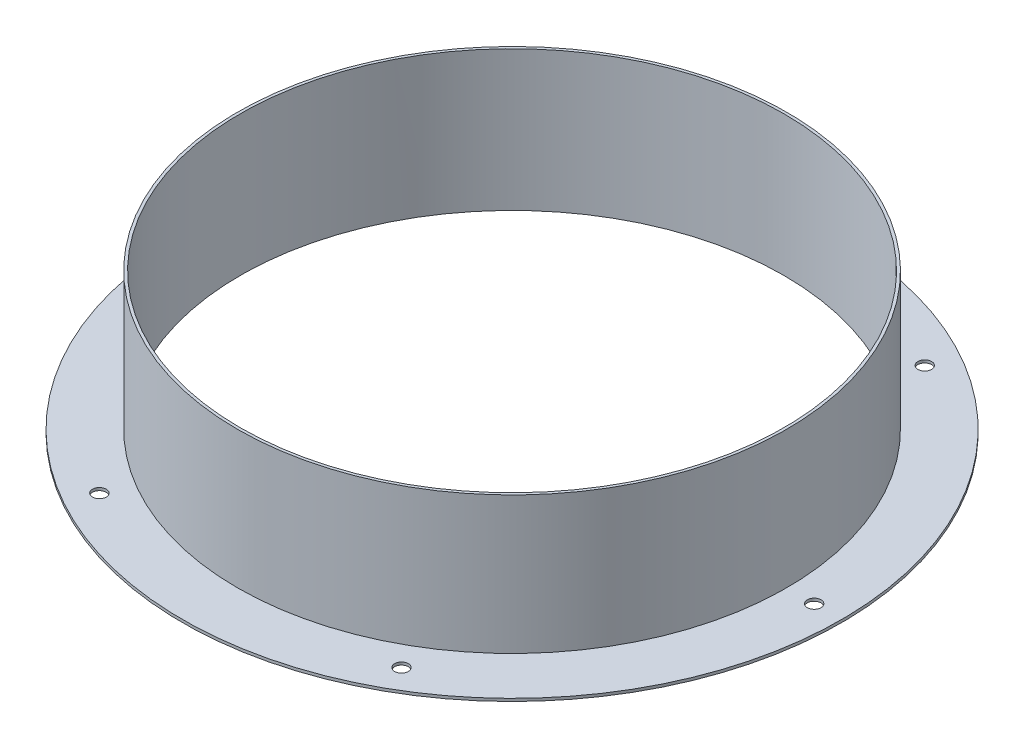
ISO-10303-21;
HEADER;
FILE_DESCRIPTION(('STEP AP214'),'2;1');
FILE_NAME('part.step','',(''),(''),'','','');
FILE_SCHEMA(('AUTOMOTIVE_DESIGN { 1 0 10303 214 1 1 1 1 }'));
ENDSEC;
DATA;
#1=APPLICATION_CONTEXT('core data for automotive mechanical design processes');
#2=APPLICATION_PROTOCOL_DEFINITION('international standard','automotive_design',2000,#1);
#3=PRODUCT_CONTEXT('',#1,'mechanical');
#4=PRODUCT('Part','Part','',(#3));
#5=PRODUCT_RELATED_PRODUCT_CATEGORY('part','',(#4));
#6=PRODUCT_DEFINITION_FORMATION('','',#4);
#7=PRODUCT_DEFINITION_CONTEXT('part definition',#1,'design');
#8=PRODUCT_DEFINITION('design','',#6,#7);
#9=PRODUCT_DEFINITION_SHAPE('','',#8);
#10=(LENGTH_UNIT() NAMED_UNIT(*) SI_UNIT(.MILLI.,.METRE.));
#11=(NAMED_UNIT(*) PLANE_ANGLE_UNIT() SI_UNIT($,.RADIAN.));
#12=(NAMED_UNIT(*) SI_UNIT($,.STERADIAN.) SOLID_ANGLE_UNIT());
#13=UNCERTAINTY_MEASURE_WITH_UNIT(LENGTH_MEASURE(1.E-05),#10,'distance_accuracy_value','');
#14=(GEOMETRIC_REPRESENTATION_CONTEXT(3) GLOBAL_UNCERTAINTY_ASSIGNED_CONTEXT((#13)) GLOBAL_UNIT_ASSIGNED_CONTEXT((#10,
#11,#12)) REPRESENTATION_CONTEXT('',''));
#15=CARTESIAN_POINT('',(0.,0.,0.));
#16=DIRECTION('',(0.,0.,1.));
#17=DIRECTION('',(1.,0.,0.));
#18=AXIS2_PLACEMENT_3D('',#15,#16,#17);
#19=CARTESIAN_POINT('',(0.,50.,0.));
#20=DIRECTION('',(0.,1.,0.));
#21=DIRECTION('',(0.,0.,1.));
#22=AXIS2_PLACEMENT_3D('',#19,#20,#21);
#23=PLANE('',#22);
#24=CARTESIAN_POINT('',(0.,50.,0.));
#25=DIRECTION('',(0.,1.,0.));
#26=DIRECTION('',(0.,0.,1.));
#27=AXIS2_PLACEMENT_3D('',#24,#25,#26);
#28=CIRCLE('',#27,100.);
#29=CARTESIAN_POINT('',(0.,50.,100.));
#30=VERTEX_POINT('',#29);
#31=EDGE_CURVE('E10',#30,#30,#28,.T.);
#32=ORIENTED_EDGE('',*,*,#31,.T.);
#33=EDGE_LOOP('',(#32));
#34=FACE_BOUND('',#33,.T.);
#35=CARTESIAN_POINT('',(0.,50.,0.));
#36=DIRECTION('',(0.,1.,0.));
#37=DIRECTION('',(0.,0.,1.));
#38=AXIS2_PLACEMENT_3D('',#35,#36,#37);
#39=CIRCLE('',#38,99.);
#40=CARTESIAN_POINT('',(0.,50.,99.));
#41=VERTEX_POINT('',#40);
#42=EDGE_CURVE('E43',#41,#41,#39,.T.);
#43=ORIENTED_EDGE('',*,*,#42,.F.);
#44=EDGE_LOOP('',(#43));
#45=FACE_BOUND('',#44,.T.);
#46=ADVANCED_FACE('F35',(#34,#45),#23,.T.);
#47=CARTESIAN_POINT('',(0.,50.,0.));
#48=DIRECTION('',(0.,-1.,0.));
#49=DIRECTION('',(0.,0.,-1.));
#50=AXIS2_PLACEMENT_3D('',#47,#48,#49);
#51=CYLINDRICAL_SURFACE('',#50,100.);
#52=ORIENTED_EDGE('',*,*,#31,.F.);
#53=EDGE_LOOP('',(#52));
#54=FACE_BOUND('',#53,.T.);
#55=CARTESIAN_POINT('',(0.,0.,0.));
#56=DIRECTION('',(0.,1.,0.));
#57=DIRECTION('',(0.,0.,1.));
#58=AXIS2_PLACEMENT_3D('',#55,#56,#57);
#59=CIRCLE('',#58,100.);
#60=CARTESIAN_POINT('',(0.,0.,100.));
#61=VERTEX_POINT('',#60);
#62=EDGE_CURVE('E39',#61,#61,#59,.T.);
#63=ORIENTED_EDGE('',*,*,#62,.T.);
#64=EDGE_LOOP('',(#63));
#65=FACE_BOUND('',#64,.T.);
#66=ADVANCED_FACE('F37',(#54,#65),#51,.T.);
#67=CARTESIAN_POINT('',(0.,50.,0.));
#68=DIRECTION('',(0.,-1.,0.));
#69=DIRECTION('',(0.,0.,-1.));
#70=AXIS2_PLACEMENT_3D('',#67,#68,#69);
#71=CYLINDRICAL_SURFACE('',#70,99.);
#72=ORIENTED_EDGE('',*,*,#42,.T.);
#73=EDGE_LOOP('',(#72));
#74=FACE_BOUND('',#73,.T.);
#75=CARTESIAN_POINT('',(0.,-1.,0.));
#76=DIRECTION('',(0.,-1.,0.));
#77=DIRECTION('',(0.,0.,-1.));
#78=AXIS2_PLACEMENT_3D('',#75,#76,#77);
#79=CIRCLE('',#78,99.);
#80=CARTESIAN_POINT('',(0.,-1.,-99.));
#81=VERTEX_POINT('',#80);
#82=EDGE_CURVE('E53',#81,#81,#79,.T.);
#83=ORIENTED_EDGE('',*,*,#82,.T.);
#84=EDGE_LOOP('',(#83));
#85=FACE_BOUND('',#84,.T.);
#86=ADVANCED_FACE('F141',(#74,#85),#71,.F.);
#87=CARTESIAN_POINT('',(0.,-1.,0.));
#88=DIRECTION('',(0.,-1.,0.));
#89=DIRECTION('',(0.,0.,-1.));
#90=AXIS2_PLACEMENT_3D('',#87,#88,#89);
#91=PLANE('',#90);
#92=CARTESIAN_POINT('',(-110.,-1.,0.));
#93=DIRECTION('',(0.,1.,0.));
#94=DIRECTION('',(0.,0.,1.));
#95=AXIS2_PLACEMENT_3D('',#92,#93,#94);
#96=CIRCLE('',#95,2.50000000000001);
#97=CARTESIAN_POINT('',(-110.,-1.,2.50000000000001));
#98=VERTEX_POINT('',#97);
#99=EDGE_CURVE('E58',#98,#98,#96,.T.);
#100=ORIENTED_EDGE('',*,*,#99,.T.);
#101=EDGE_LOOP('',(#100));
#102=FACE_BOUND('',#101,.T.);
#103=CARTESIAN_POINT('',(-55.0000000000011,-1.,95.2627944162876));
#104=DIRECTION('',(0.,1.,0.));
#105=DIRECTION('',(0.,0.,1.));
#106=AXIS2_PLACEMENT_3D('',#103,#104,#105);
#107=CIRCLE('',#106,2.5);
#108=CARTESIAN_POINT('',(-55.0000000000011,-1.,97.7627944162876));
#109=VERTEX_POINT('',#108);
#110=EDGE_CURVE('E63',#109,#109,#107,.T.);
#111=ORIENTED_EDGE('',*,*,#110,.T.);
#112=EDGE_LOOP('',(#111));
#113=FACE_BOUND('',#112,.T.);
#114=CARTESIAN_POINT('',(54.9999999999991,-1.,95.2627944162888));
#115=DIRECTION('',(0.,1.,0.));
#116=DIRECTION('',(0.,0.,1.));
#117=AXIS2_PLACEMENT_3D('',#114,#115,#116);
#118=CIRCLE('',#117,2.50000000000001);
#119=CARTESIAN_POINT('',(54.9999999999991,-1.,97.7627944162888));
#120=VERTEX_POINT('',#119);
#121=EDGE_CURVE('E62',#120,#120,#118,.T.);
#122=ORIENTED_EDGE('',*,*,#121,.T.);
#123=EDGE_LOOP('',(#122));
#124=FACE_BOUND('',#123,.T.);
#125=CARTESIAN_POINT('',(110.,-1.,7.68125894545489E-13));
#126=DIRECTION('',(0.,1.,0.));
#127=DIRECTION('',(0.,0.,1.));
#128=AXIS2_PLACEMENT_3D('',#125,#126,#127);
#129=CIRCLE('',#128,2.5);
#130=CARTESIAN_POINT('',(110.,-1.,2.50000000000077));
#131=VERTEX_POINT('',#130);
#132=EDGE_CURVE('E69',#131,#131,#129,.T.);
#133=ORIENTED_EDGE('',*,*,#132,.T.);
#134=EDGE_LOOP('',(#133));
#135=FACE_BOUND('',#134,.T.);
#136=CARTESIAN_POINT('',(55.0000000000005,-1.,-95.262794416288));
#137=DIRECTION('',(0.,1.,0.));
#138=DIRECTION('',(0.,0.,1.));
#139=AXIS2_PLACEMENT_3D('',#136,#137,#138);
#140=CIRCLE('',#139,2.5);
#141=CARTESIAN_POINT('',(55.0000000000005,-1.,-92.762794416288));
#142=VERTEX_POINT('',#141);
#143=EDGE_CURVE('E75',#142,#142,#140,.T.);
#144=ORIENTED_EDGE('',*,*,#143,.T.);
#145=EDGE_LOOP('',(#144));
#146=FACE_BOUND('',#145,.T.);
#147=CARTESIAN_POINT('',(-54.9999999999998,-1.,-95.2627944162884));
#148=DIRECTION('',(0.,1.,0.));
#149=DIRECTION('',(0.,0.,1.));
#150=AXIS2_PLACEMENT_3D('',#147,#148,#149);
#151=CIRCLE('',#150,2.50000000000001);
#152=CARTESIAN_POINT('',(-54.9999999999998,-1.,-92.7627944162884));
#153=VERTEX_POINT('',#152);
#154=EDGE_CURVE('E81',#153,#153,#151,.T.);
#155=ORIENTED_EDGE('',*,*,#154,.T.);
#156=EDGE_LOOP('',(#155));
#157=FACE_BOUND('',#156,.T.);
#158=CARTESIAN_POINT('',(0.,-1.,0.));
#159=DIRECTION('',(0.,-1.,0.));
#160=DIRECTION('',(0.,0.,-1.));
#161=AXIS2_PLACEMENT_3D('',#158,#159,#160);
#162=CIRCLE('',#161,120.);
#163=CARTESIAN_POINT('',(0.,-1.,-120.));
#164=VERTEX_POINT('',#163);
#165=EDGE_CURVE('E52',#164,#164,#162,.T.);
#166=ORIENTED_EDGE('',*,*,#165,.T.);
#167=EDGE_LOOP('',(#166));
#168=FACE_BOUND('',#167,.T.);
#169=ORIENTED_EDGE('',*,*,#82,.F.);
#170=EDGE_LOOP('',(#169));
#171=FACE_BOUND('',#170,.T.);
#172=ADVANCED_FACE('F95',(#102,#113,#124,#135,#146,#157,#168,#171),#91,.T.);
#173=CARTESIAN_POINT('',(0.,0.,0.));
#174=DIRECTION('',(0.,-1.,0.));
#175=DIRECTION('',(0.,0.,-1.));
#176=AXIS2_PLACEMENT_3D('',#173,#174,#175);
#177=PLANE('',#176);
#178=CARTESIAN_POINT('',(-110.,0.,0.));
#179=DIRECTION('',(0.,1.,0.));
#180=DIRECTION('',(0.,0.,1.));
#181=AXIS2_PLACEMENT_3D('',#178,#179,#180);
#182=CIRCLE('',#181,2.50000000000001);
#183=CARTESIAN_POINT('',(-110.,0.,2.50000000000001));
#184=VERTEX_POINT('',#183);
#185=EDGE_CURVE('E84',#184,#184,#182,.T.);
#186=ORIENTED_EDGE('',*,*,#185,.F.);
#187=EDGE_LOOP('',(#186));
#188=FACE_BOUND('',#187,.T.);
#189=CARTESIAN_POINT('',(-55.0000000000011,0.,95.2627944162876));
#190=DIRECTION('',(0.,1.,0.));
#191=DIRECTION('',(0.,0.,1.));
#192=AXIS2_PLACEMENT_3D('',#189,#190,#191);
#193=CIRCLE('',#192,2.5);
#194=CARTESIAN_POINT('',(-55.0000000000011,0.,97.7627944162876));
#195=VERTEX_POINT('',#194);
#196=EDGE_CURVE('E85',#195,#195,#193,.T.);
#197=ORIENTED_EDGE('',*,*,#196,.F.);
#198=EDGE_LOOP('',(#197));
#199=FACE_BOUND('',#198,.T.);
#200=CARTESIAN_POINT('',(54.9999999999991,0.,95.2627944162888));
#201=DIRECTION('',(0.,1.,0.));
#202=DIRECTION('',(0.,0.,1.));
#203=AXIS2_PLACEMENT_3D('',#200,#201,#202);
#204=CIRCLE('',#203,2.50000000000001);
#205=CARTESIAN_POINT('',(54.9999999999991,0.,97.7627944162888));
#206=VERTEX_POINT('',#205);
#207=EDGE_CURVE('E59',#206,#206,#204,.T.);
#208=ORIENTED_EDGE('',*,*,#207,.F.);
#209=EDGE_LOOP('',(#208));
#210=FACE_BOUND('',#209,.T.);
#211=CARTESIAN_POINT('',(110.,0.,7.68125894545489E-13));
#212=DIRECTION('',(0.,1.,0.));
#213=DIRECTION('',(0.,0.,1.));
#214=AXIS2_PLACEMENT_3D('',#211,#212,#213);
#215=CIRCLE('',#214,2.5);
#216=CARTESIAN_POINT('',(110.,0.,2.50000000000077));
#217=VERTEX_POINT('',#216);
#218=EDGE_CURVE('E66',#217,#217,#215,.T.);
#219=ORIENTED_EDGE('',*,*,#218,.F.);
#220=EDGE_LOOP('',(#219));
#221=FACE_BOUND('',#220,.T.);
#222=CARTESIAN_POINT('',(55.0000000000005,0.,-95.262794416288));
#223=DIRECTION('',(0.,1.,0.));
#224=DIRECTION('',(0.,0.,1.));
#225=AXIS2_PLACEMENT_3D('',#222,#223,#224);
#226=CIRCLE('',#225,2.5);
#227=CARTESIAN_POINT('',(55.0000000000005,0.,-92.762794416288));
#228=VERTEX_POINT('',#227);
#229=EDGE_CURVE('E72',#228,#228,#226,.T.);
#230=ORIENTED_EDGE('',*,*,#229,.F.);
#231=EDGE_LOOP('',(#230));
#232=FACE_BOUND('',#231,.T.);
#233=CARTESIAN_POINT('',(-54.9999999999998,0.,-95.2627944162884));
#234=DIRECTION('',(0.,1.,0.));
#235=DIRECTION('',(0.,0.,1.));
#236=AXIS2_PLACEMENT_3D('',#233,#234,#235);
#237=CIRCLE('',#236,2.50000000000001);
#238=CARTESIAN_POINT('',(-54.9999999999998,0.,-92.7627944162884));
#239=VERTEX_POINT('',#238);
#240=EDGE_CURVE('E78',#239,#239,#237,.T.);
#241=ORIENTED_EDGE('',*,*,#240,.F.);
#242=EDGE_LOOP('',(#241));
#243=FACE_BOUND('',#242,.T.);
#244=ORIENTED_EDGE('',*,*,#62,.F.);
#245=EDGE_LOOP('',(#244));
#246=FACE_BOUND('',#245,.T.);
#247=CARTESIAN_POINT('',(0.,0.,0.));
#248=DIRECTION('',(0.,-1.,0.));
#249=DIRECTION('',(0.,0.,-1.));
#250=AXIS2_PLACEMENT_3D('',#247,#248,#249);
#251=CIRCLE('',#250,120.);
#252=CARTESIAN_POINT('',(0.,0.,-120.));
#253=VERTEX_POINT('',#252);
#254=EDGE_CURVE('E49',#253,#253,#251,.T.);
#255=ORIENTED_EDGE('',*,*,#254,.F.);
#256=EDGE_LOOP('',(#255));
#257=FACE_BOUND('',#256,.T.);
#258=ADVANCED_FACE('F105',(#188,#199,#210,#221,#232,#243,#246,#257),#177,.F.);
#259=CARTESIAN_POINT('',(0.,-1.,0.));
#260=DIRECTION('',(0.,1.,0.));
#261=DIRECTION('',(0.,0.,1.));
#262=AXIS2_PLACEMENT_3D('',#259,#260,#261);
#263=CYLINDRICAL_SURFACE('',#262,120.);
#264=ORIENTED_EDGE('',*,*,#165,.F.);
#265=EDGE_LOOP('',(#264));
#266=FACE_BOUND('',#265,.T.);
#267=ORIENTED_EDGE('',*,*,#254,.T.);
#268=EDGE_LOOP('',(#267));
#269=FACE_BOUND('',#268,.T.);
#270=ADVANCED_FACE('F108',(#266,#269),#263,.T.);
#271=CARTESIAN_POINT('',(-54.9999999999998,-1.,-95.2627944162884));
#272=DIRECTION('',(0.,1.,0.));
#273=DIRECTION('',(0.,0.,1.));
#274=AXIS2_PLACEMENT_3D('',#271,#272,#273);
#275=CYLINDRICAL_SURFACE('',#274,2.50000000000001);
#276=ORIENTED_EDGE('',*,*,#154,.F.);
#277=EDGE_LOOP('',(#276));
#278=FACE_BOUND('',#277,.T.);
#279=ORIENTED_EDGE('',*,*,#240,.T.);
#280=EDGE_LOOP('',(#279));
#281=FACE_BOUND('',#280,.T.);
#282=ADVANCED_FACE('F126',(#278,#281),#275,.F.);
#283=CARTESIAN_POINT('',(55.0000000000005,-1.,-95.262794416288));
#284=DIRECTION('',(0.,1.,0.));
#285=DIRECTION('',(0.,0.,1.));
#286=AXIS2_PLACEMENT_3D('',#283,#284,#285);
#287=CYLINDRICAL_SURFACE('',#286,2.5);
#288=ORIENTED_EDGE('',*,*,#143,.F.);
#289=EDGE_LOOP('',(#288));
#290=FACE_BOUND('',#289,.T.);
#291=ORIENTED_EDGE('',*,*,#229,.T.);
#292=EDGE_LOOP('',(#291));
#293=FACE_BOUND('',#292,.T.);
#294=ADVANCED_FACE('F132',(#290,#293),#287,.F.);
#295=CARTESIAN_POINT('',(110.,-1.,7.68125894545489E-13));
#296=DIRECTION('',(0.,1.,0.));
#297=DIRECTION('',(0.,0.,1.));
#298=AXIS2_PLACEMENT_3D('',#295,#296,#297);
#299=CYLINDRICAL_SURFACE('',#298,2.5);
#300=ORIENTED_EDGE('',*,*,#132,.F.);
#301=EDGE_LOOP('',(#300));
#302=FACE_BOUND('',#301,.T.);
#303=ORIENTED_EDGE('',*,*,#218,.T.);
#304=EDGE_LOOP('',(#303));
#305=FACE_BOUND('',#304,.T.);
#306=ADVANCED_FACE('F160',(#302,#305),#299,.F.);
#307=CARTESIAN_POINT('',(54.9999999999991,-1.,95.2627944162888));
#308=DIRECTION('',(0.,1.,0.));
#309=DIRECTION('',(0.,0.,1.));
#310=AXIS2_PLACEMENT_3D('',#307,#308,#309);
#311=CYLINDRICAL_SURFACE('',#310,2.50000000000001);
#312=ORIENTED_EDGE('',*,*,#121,.F.);
#313=EDGE_LOOP('',(#312));
#314=FACE_BOUND('',#313,.T.);
#315=ORIENTED_EDGE('',*,*,#207,.T.);
#316=EDGE_LOOP('',(#315));
#317=FACE_BOUND('',#316,.T.);
#318=ADVANCED_FACE('F157',(#314,#317),#311,.F.);
#319=CARTESIAN_POINT('',(-55.0000000000011,-1.,95.2627944162876));
#320=DIRECTION('',(0.,1.,0.));
#321=DIRECTION('',(0.,0.,1.));
#322=AXIS2_PLACEMENT_3D('',#319,#320,#321);
#323=CYLINDRICAL_SURFACE('',#322,2.5);
#324=ORIENTED_EDGE('',*,*,#110,.F.);
#325=EDGE_LOOP('',(#324));
#326=FACE_BOUND('',#325,.T.);
#327=ORIENTED_EDGE('',*,*,#196,.T.);
#328=EDGE_LOOP('',(#327));
#329=FACE_BOUND('',#328,.T.);
#330=ADVANCED_FACE('F101',(#326,#329),#323,.F.);
#331=CARTESIAN_POINT('',(-110.,-1.,0.));
#332=DIRECTION('',(0.,1.,0.));
#333=DIRECTION('',(0.,0.,1.));
#334=AXIS2_PLACEMENT_3D('',#331,#332,#333);
#335=CYLINDRICAL_SURFACE('',#334,2.50000000000001);
#336=ORIENTED_EDGE('',*,*,#99,.F.);
#337=EDGE_LOOP('',(#336));
#338=FACE_BOUND('',#337,.T.);
#339=ORIENTED_EDGE('',*,*,#185,.T.);
#340=EDGE_LOOP('',(#339));
#341=FACE_BOUND('',#340,.T.);
#342=ADVANCED_FACE('F98',(#338,#341),#335,.F.);
#343=CLOSED_SHELL('',(#46,#66,#86,#172,#258,#270,#282,#294,#306,#318,#330,#342));
#344=MANIFOLD_SOLID_BREP('B2',#343);
#345=ADVANCED_BREP_SHAPE_REPRESENTATION('',(#18,#344),#14);
#346=SHAPE_DEFINITION_REPRESENTATION(#9,#345);
ENDSEC;
END-ISO-10303-21;
